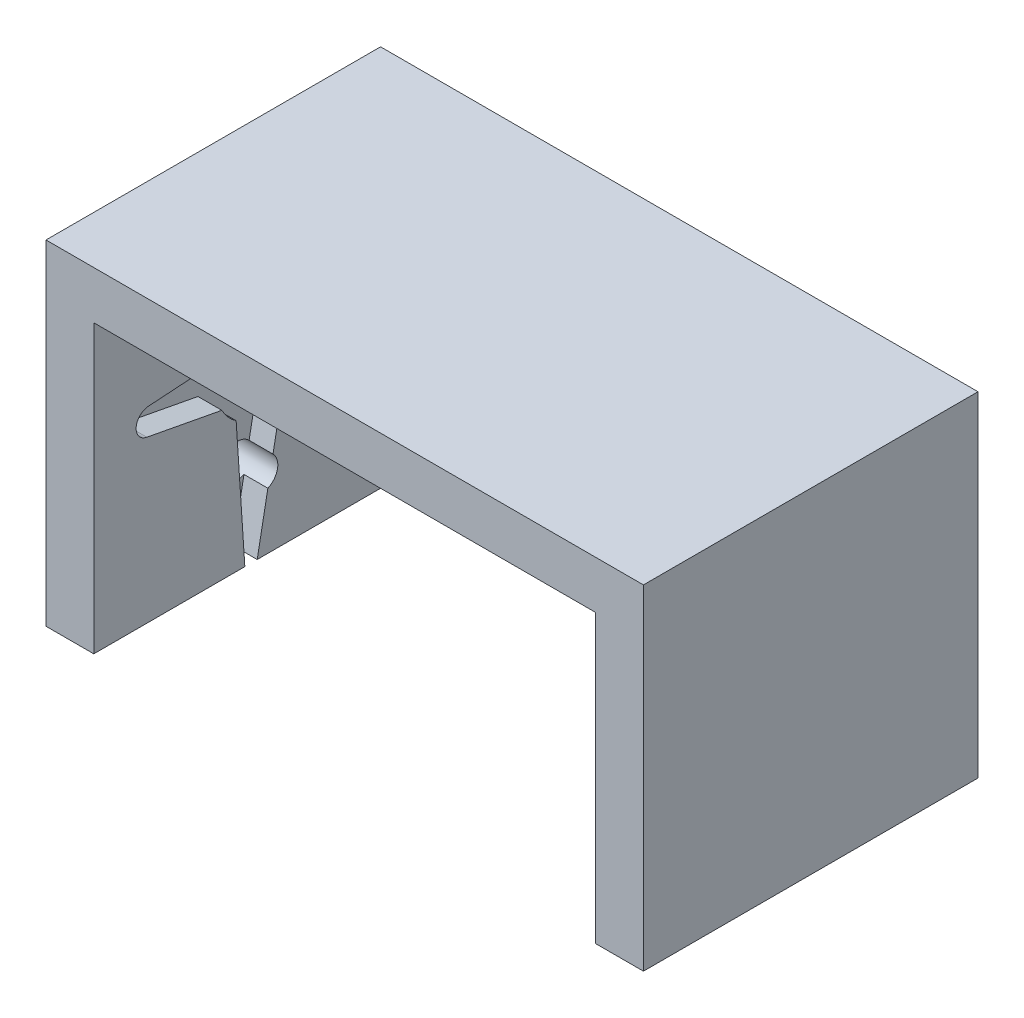
ISO-10303-21;
HEADER;
FILE_DESCRIPTION(('STEP AP214'),'2;1');
FILE_NAME('part.step','',(''),(''),'','','');
FILE_SCHEMA(('AUTOMOTIVE_DESIGN { 1 0 10303 214 1 1 1 1 }'));
ENDSEC;
DATA;
#1=APPLICATION_CONTEXT('core data for automotive mechanical design processes');
#2=APPLICATION_PROTOCOL_DEFINITION('international standard','automotive_design',2000,#1);
#3=PRODUCT_CONTEXT('',#1,'mechanical');
#4=PRODUCT('Part','Part','',(#3));
#5=PRODUCT_RELATED_PRODUCT_CATEGORY('part','',(#4));
#6=PRODUCT_DEFINITION_FORMATION('','',#4);
#7=PRODUCT_DEFINITION_CONTEXT('part definition',#1,'design');
#8=PRODUCT_DEFINITION('design','',#6,#7);
#9=PRODUCT_DEFINITION_SHAPE('','',#8);
#10=(LENGTH_UNIT() NAMED_UNIT(*) SI_UNIT(.MILLI.,.METRE.));
#11=(NAMED_UNIT(*) PLANE_ANGLE_UNIT() SI_UNIT($,.RADIAN.));
#12=(NAMED_UNIT(*) SI_UNIT($,.STERADIAN.) SOLID_ANGLE_UNIT());
#13=UNCERTAINTY_MEASURE_WITH_UNIT(LENGTH_MEASURE(1.E-05),#10,'distance_accuracy_value','');
#14=(GEOMETRIC_REPRESENTATION_CONTEXT(3) GLOBAL_UNCERTAINTY_ASSIGNED_CONTEXT((#13)) GLOBAL_UNIT_ASSIGNED_CONTEXT((#10,
#11,#12)) REPRESENTATION_CONTEXT('',''));
#15=CARTESIAN_POINT('',(0.,0.,0.));
#16=DIRECTION('',(0.,0.,1.));
#17=DIRECTION('',(1.,0.,0.));
#18=AXIS2_PLACEMENT_3D('',#15,#16,#17);
#19=CARTESIAN_POINT('',(-52.5,-60.,35.));
#20=DIRECTION('',(-1.,0.,0.));
#21=DIRECTION('',(0.,0.,1.));
#22=AXIS2_PLACEMENT_3D('',#19,#20,#21);
#23=PLANE('',#22);
#24=DIRECTION('',(0.,0.,1.));
#25=VECTOR('',#24,1.);
#26=CARTESIAN_POINT('',(-52.5,-60.,35.));
#27=LINE('',#26,#25);
#28=CARTESIAN_POINT('',(-52.5,-60.,3.39593215230434));
#29=VERTEX_POINT('',#28);
#30=CARTESIAN_POINT('',(-52.5,-60.,35.));
#31=VERTEX_POINT('',#30);
#32=EDGE_CURVE('E368',#29,#31,#27,.T.);
#33=ORIENTED_EDGE('',*,*,#32,.F.);
#34=DIRECTION('',(0.,-0.997785493856374,-0.0665139703355023));
#35=VECTOR('',#34,1.);
#36=CARTESIAN_POINT('',(-52.5,-0.490823219577113,7.36290866522704));
#37=LINE('',#36,#35);
#38=CARTESIAN_POINT('',(-52.5,-32.6363414986812,5.22003721399762));
#39=VERTEX_POINT('',#38);
#40=EDGE_CURVE('E313',#39,#29,#37,.T.);
#41=ORIENTED_EDGE('',*,*,#40,.F.);
#42=CARTESIAN_POINT('',(-52.5,-25.,0.));
#43=DIRECTION('',(1.,0.,0.));
#44=DIRECTION('',(0.,0.,-1.));
#45=AXIS2_PLACEMENT_3D('',#42,#43,#44);
#46=CIRCLE('',#45,9.25);
#47=CARTESIAN_POINT('',(-52.5,-29.2626707999104,8.20927144462841));
#48=VERTEX_POINT('',#47);
#49=EDGE_CURVE('E310',#48,#39,#46,.T.);
#50=ORIENTED_EDGE('',*,*,#49,.F.);
#51=DIRECTION('',(0.,0.18616079610696,0.982519291410007));
#52=VECTOR('',#51,1.);
#53=CARTESIAN_POINT('',(-52.5,-29.7500780146594,5.6368340610444));
#54=LINE('',#53,#52);
#55=CARTESIAN_POINT('',(-52.5,-26.2884644062094,23.9065354204832));
#56=VERTEX_POINT('',#55);
#57=EDGE_CURVE('E307',#48,#56,#54,.T.);
#58=ORIENTED_EDGE('',*,*,#57,.T.);
#59=CARTESIAN_POINT('',(-52.5,-23.5865363548319,23.3945932311891));
#60=DIRECTION('',(1.,0.,0.));
#61=DIRECTION('',(0.,0.,-1.));
#62=AXIS2_PLACEMENT_3D('',#59,#60,#61);
#63=CIRCLE('',#62,2.75);
#64=CARTESIAN_POINT('',(-52.5,-20.8426262467269,23.5775066496117));
#65=VERTEX_POINT('',#64);
#66=EDGE_CURVE('E304',#65,#56,#63,.T.);
#67=ORIENTED_EDGE('',*,*,#66,.F.);
#68=DIRECTION('',(0.,0.0665139703354918,-0.997785493856375));
#69=VECTOR('',#68,1.);
#70=CARTESIAN_POINT('',(-52.5,-19.1856554970171,-1.27894635515643));
#71=LINE('',#70,#69);
#72=CARTESIAN_POINT('',(-52.5,-19.7799627860023,7.63634149868115));
#73=VERTEX_POINT('',#72);
#74=EDGE_CURVE('E301',#65,#73,#71,.T.);
#75=ORIENTED_EDGE('',*,*,#74,.T.);
#76=CARTESIAN_POINT('',(-52.5,-25.,0.));
#77=DIRECTION('',(1.,0.,0.));
#78=DIRECTION('',(0.,0.,-1.));
#79=AXIS2_PLACEMENT_3D('',#76,#77,#78);
#80=CIRCLE('',#79,9.25);
#81=CARTESIAN_POINT('',(-52.5,-16.7907285553716,4.26267079991049));
#82=VERTEX_POINT('',#81);
#83=EDGE_CURVE('E298',#82,#73,#80,.T.);
#84=ORIENTED_EDGE('',*,*,#83,.F.);
#85=DIRECTION('',(0.,0.982519291410008,-0.186160796106958));
#86=VECTOR('',#85,1.);
#87=CARTESIAN_POINT('',(-52.5,0.197773673881687,1.04380972785561));
#88=LINE('',#87,#86);
#89=CARTESIAN_POINT('',(-52.5,0.,1.08128248274267));
#90=VERTEX_POINT('',#89);
#91=EDGE_CURVE('E295',#82,#90,#88,.T.);
#92=ORIENTED_EDGE('',*,*,#91,.T.);
#93=DIRECTION('',(0.,0.,1.));
#94=VECTOR('',#93,1.);
#95=CARTESIAN_POINT('',(-52.5,0.,35.));
#96=LINE('',#95,#94);
#97=CARTESIAN_POINT('',(-52.5,0.,35.));
#98=VERTEX_POINT('',#97);
#99=EDGE_CURVE('E361',#90,#98,#96,.T.);
#100=ORIENTED_EDGE('',*,*,#99,.T.);
#101=DIRECTION('',(0.,1.,0.));
#102=VECTOR('',#101,1.);
#103=CARTESIAN_POINT('',(-52.5,-60.,35.));
#104=LINE('',#103,#102);
#105=EDGE_CURVE('E375',#31,#98,#104,.T.);
#106=ORIENTED_EDGE('',*,*,#105,.F.);
#107=EDGE_LOOP('',(#33,#41,#50,#58,#67,#75,#84,#92,#100,#106));
#108=FACE_BOUND('',#107,.T.);
#109=ADVANCED_FACE('F33',(#108),#23,.F.);
#110=CARTESIAN_POINT('',(0.,0.,0.));
#111=DIRECTION('',(0.,1.,0.));
#112=DIRECTION('',(0.,0.,1.));
#113=AXIS2_PLACEMENT_3D('',#110,#111,#112);
#114=PLANE('',#113);
#115=DIRECTION('',(0.,0.,-1.));
#116=VECTOR('',#115,1.);
#117=CARTESIAN_POINT('',(52.5,0.,35.));
#118=LINE('',#117,#116);
#119=CARTESIAN_POINT('',(52.5,0.,35.));
#120=VERTEX_POINT('',#119);
#121=CARTESIAN_POINT('',(52.5,0.,-35.));
#122=VERTEX_POINT('',#121);
#123=EDGE_CURVE('E227',#120,#122,#118,.T.);
#124=ORIENTED_EDGE('',*,*,#123,.F.);
#125=DIRECTION('',(1.,0.,0.));
#126=VECTOR('',#125,1.);
#127=CARTESIAN_POINT('',(-62.5,0.,35.));
#128=LINE('',#127,#126);
#129=EDGE_CURVE('E387',#98,#120,#128,.T.);
#130=ORIENTED_EDGE('',*,*,#129,.F.);
#131=ORIENTED_EDGE('',*,*,#99,.F.);
#132=DIRECTION('',(1.,0.,0.));
#133=VECTOR('',#132,1.);
#134=CARTESIAN_POINT('',(-57.5,0.,1.08128248274267));
#135=LINE('',#134,#133);
#136=CARTESIAN_POINT('',(-57.5,0.,1.08128248274267));
#137=VERTEX_POINT('',#136);
#138=EDGE_CURVE('E331',#137,#90,#135,.T.);
#139=ORIENTED_EDGE('',*,*,#138,.F.);
#140=DIRECTION('',(0.,0.,1.));
#141=VECTOR('',#140,1.);
#142=CARTESIAN_POINT('',(-57.5,0.,0.));
#143=LINE('',#142,#141);
#144=CARTESIAN_POINT('',(-57.5,0.,-4.06254808072844));
#145=VERTEX_POINT('',#144);
#146=EDGE_CURVE('E255',#145,#137,#143,.T.);
#147=ORIENTED_EDGE('',*,*,#146,.F.);
#148=DIRECTION('',(1.,0.,0.));
#149=VECTOR('',#148,1.);
#150=CARTESIAN_POINT('',(-57.5,0.,-4.06254808072844));
#151=LINE('',#150,#149);
#152=CARTESIAN_POINT('',(-52.5,0.,-4.06254808072844));
#153=VERTEX_POINT('',#152);
#154=EDGE_CURVE('E333',#145,#153,#151,.T.);
#155=ORIENTED_EDGE('',*,*,#154,.T.);
#156=CARTESIAN_POINT('',(-52.5,0.,-35.));
#157=VERTEX_POINT('',#156);
#158=EDGE_CURVE('E366',#157,#153,#96,.T.);
#159=ORIENTED_EDGE('',*,*,#158,.F.);
#160=DIRECTION('',(-1.,0.,0.));
#161=VECTOR('',#160,1.);
#162=CARTESIAN_POINT('',(-62.5,0.,-35.));
#163=LINE('',#162,#161);
#164=EDGE_CURVE('E56',#122,#157,#163,.T.);
#165=ORIENTED_EDGE('',*,*,#164,.F.);
#166=EDGE_LOOP('',(#124,#130,#131,#139,#147,#155,#159,#165));
#167=FACE_BOUND('',#166,.T.);
#168=ADVANCED_FACE('F435',(#167),#114,.F.);
#169=CARTESIAN_POINT('',(62.5,10.,-35.));
#170=DIRECTION('',(-1.,0.,0.));
#171=DIRECTION('',(0.,0.,1.));
#172=AXIS2_PLACEMENT_3D('',#169,#170,#171);
#173=PLANE('',#172);
#174=DIRECTION('',(0.,-1.,0.));
#175=VECTOR('',#174,1.);
#176=CARTESIAN_POINT('',(62.5,10.,35.));
#177=LINE('',#176,#175);
#178=CARTESIAN_POINT('',(62.5,10.,35.));
#179=VERTEX_POINT('',#178);
#180=CARTESIAN_POINT('',(62.5,-60.,35.));
#181=VERTEX_POINT('',#180);
#182=EDGE_CURVE('E393',#179,#181,#177,.T.);
#183=ORIENTED_EDGE('',*,*,#182,.T.);
#184=DIRECTION('',(0.,0.,1.));
#185=VECTOR('',#184,1.);
#186=CARTESIAN_POINT('',(62.5,-60.,35.));
#187=LINE('',#186,#185);
#188=CARTESIAN_POINT('',(62.5,-60.,-35.));
#189=VERTEX_POINT('',#188);
#190=EDGE_CURVE('E346',#189,#181,#187,.T.);
#191=ORIENTED_EDGE('',*,*,#190,.F.);
#192=DIRECTION('',(0.,-1.,0.));
#193=VECTOR('',#192,1.);
#194=CARTESIAN_POINT('',(62.5,10.,-35.));
#195=LINE('',#194,#193);
#196=CARTESIAN_POINT('',(62.5,10.,-35.));
#197=VERTEX_POINT('',#196);
#198=EDGE_CURVE('E11',#197,#189,#195,.T.);
#199=ORIENTED_EDGE('',*,*,#198,.F.);
#200=DIRECTION('',(0.,0.,-1.));
#201=VECTOR('',#200,1.);
#202=CARTESIAN_POINT('',(62.5,10.,-35.));
#203=LINE('',#202,#201);
#204=EDGE_CURVE('E383',#179,#197,#203,.T.);
#205=ORIENTED_EDGE('',*,*,#204,.F.);
#206=EDGE_LOOP('',(#183,#191,#199,#205));
#207=FACE_BOUND('',#206,.T.);
#208=ADVANCED_FACE('F35',(#207),#173,.F.);
#209=CARTESIAN_POINT('',(-62.5,10.,-35.));
#210=DIRECTION('',(0.,0.,1.));
#211=DIRECTION('',(1.,0.,0.));
#212=AXIS2_PLACEMENT_3D('',#209,#210,#211);
#213=PLANE('',#212);
#214=ORIENTED_EDGE('',*,*,#198,.T.);
#215=DIRECTION('',(1.,0.,0.));
#216=VECTOR('',#215,1.);
#217=CARTESIAN_POINT('',(62.5,-60.,-35.));
#218=LINE('',#217,#216);
#219=CARTESIAN_POINT('',(52.5,-60.,-35.));
#220=VERTEX_POINT('',#219);
#221=EDGE_CURVE('E353',#220,#189,#218,.T.);
#222=ORIENTED_EDGE('',*,*,#221,.F.);
#223=DIRECTION('',(0.,1.,0.));
#224=VECTOR('',#223,1.);
#225=CARTESIAN_POINT('',(52.5,-60.,-35.));
#226=LINE('',#225,#224);
#227=EDGE_CURVE('E356',#220,#122,#226,.T.);
#228=ORIENTED_EDGE('',*,*,#227,.T.);
#229=ORIENTED_EDGE('',*,*,#164,.T.);
#230=DIRECTION('',(0.,1.,0.));
#231=VECTOR('',#230,1.);
#232=CARTESIAN_POINT('',(-52.5,-60.,-35.));
#233=LINE('',#232,#231);
#234=CARTESIAN_POINT('',(-52.5,-60.,-35.));
#235=VERTEX_POINT('',#234);
#236=EDGE_CURVE('E380',#235,#157,#233,.T.);
#237=ORIENTED_EDGE('',*,*,#236,.F.);
#238=DIRECTION('',(1.,0.,0.));
#239=VECTOR('',#238,1.);
#240=CARTESIAN_POINT('',(-62.5,-60.,-35.));
#241=LINE('',#240,#239);
#242=CARTESIAN_POINT('',(-62.5,-60.,-35.));
#243=VERTEX_POINT('',#242);
#244=EDGE_CURVE('E365',#243,#235,#241,.T.);
#245=ORIENTED_EDGE('',*,*,#244,.F.);
#246=DIRECTION('',(0.,-1.,0.));
#247=VECTOR('',#246,1.);
#248=CARTESIAN_POINT('',(-62.5,10.,-35.));
#249=LINE('',#248,#247);
#250=CARTESIAN_POINT('',(-62.5,10.,-35.));
#251=VERTEX_POINT('',#250);
#252=EDGE_CURVE('E41',#251,#243,#249,.T.);
#253=ORIENTED_EDGE('',*,*,#252,.F.);
#254=DIRECTION('',(-1.,0.,0.));
#255=VECTOR('',#254,1.);
#256=CARTESIAN_POINT('',(-62.5,10.,-35.));
#257=LINE('',#256,#255);
#258=EDGE_CURVE('E386',#197,#251,#257,.T.);
#259=ORIENTED_EDGE('',*,*,#258,.F.);
#260=EDGE_LOOP('',(#214,#222,#228,#229,#237,#245,#253,#259));
#261=FACE_BOUND('',#260,.T.);
#262=ADVANCED_FACE('F406',(#261),#213,.F.);
#263=CARTESIAN_POINT('',(-62.5,10.,-35.));
#264=DIRECTION('',(1.,0.,0.));
#265=DIRECTION('',(0.,0.,-1.));
#266=AXIS2_PLACEMENT_3D('',#263,#264,#265);
#267=PLANE('',#266);
#268=CARTESIAN_POINT('',(-62.5,-45.,0.));
#269=DIRECTION('',(-1.,0.,0.));
#270=DIRECTION('',(0.,0.,1.));
#271=AXIS2_PLACEMENT_3D('',#268,#269,#270);
#272=CIRCLE('',#271,3.50000000000001);
#273=CARTESIAN_POINT('',(-62.5,-45.,3.50000000000002));
#274=VERTEX_POINT('',#273);
#275=EDGE_CURVE('E691',#274,#274,#272,.T.);
#276=ORIENTED_EDGE('',*,*,#275,.F.);
#277=EDGE_LOOP('',(#276));
#278=FACE_BOUND('',#277,.T.);
#279=ORIENTED_EDGE('',*,*,#252,.T.);
#280=DIRECTION('',(0.,0.,-1.));
#281=VECTOR('',#280,1.);
#282=CARTESIAN_POINT('',(-62.5,-60.,35.));
#283=LINE('',#282,#281);
#284=CARTESIAN_POINT('',(-62.5,-60.,35.));
#285=VERTEX_POINT('',#284);
#286=EDGE_CURVE('E362',#285,#243,#283,.T.);
#287=ORIENTED_EDGE('',*,*,#286,.F.);
#288=DIRECTION('',(0.,-1.,0.));
#289=VECTOR('',#288,1.);
#290=CARTESIAN_POINT('',(-62.5,10.,35.));
#291=LINE('',#290,#289);
#292=CARTESIAN_POINT('',(-62.5,10.,35.));
#293=VERTEX_POINT('',#292);
#294=EDGE_CURVE('E398',#293,#285,#291,.T.);
#295=ORIENTED_EDGE('',*,*,#294,.F.);
#296=DIRECTION('',(0.,0.,1.));
#297=VECTOR('',#296,1.);
#298=CARTESIAN_POINT('',(-62.5,10.,-35.));
#299=LINE('',#298,#297);
#300=EDGE_CURVE('E389',#251,#293,#299,.T.);
#301=ORIENTED_EDGE('',*,*,#300,.F.);
#302=EDGE_LOOP('',(#279,#287,#295,#301));
#303=FACE_BOUND('',#302,.T.);
#304=ADVANCED_FACE('F404',(#278,#303),#267,.F.);
#305=CARTESIAN_POINT('',(-62.5,10.,35.));
#306=DIRECTION('',(0.,0.,-1.));
#307=DIRECTION('',(-1.,0.,0.));
#308=AXIS2_PLACEMENT_3D('',#305,#306,#307);
#309=PLANE('',#308);
#310=ORIENTED_EDGE('',*,*,#294,.T.);
#311=DIRECTION('',(-1.,0.,0.));
#312=VECTOR('',#311,1.);
#313=CARTESIAN_POINT('',(-62.5,-60.,35.));
#314=LINE('',#313,#312);
#315=EDGE_CURVE('E372',#31,#285,#314,.T.);
#316=ORIENTED_EDGE('',*,*,#315,.F.);
#317=ORIENTED_EDGE('',*,*,#105,.T.);
#318=ORIENTED_EDGE('',*,*,#129,.T.);
#319=DIRECTION('',(0.,1.,0.));
#320=VECTOR('',#319,1.);
#321=CARTESIAN_POINT('',(52.5,-60.,35.));
#322=LINE('',#321,#320);
#323=CARTESIAN_POINT('',(52.5,-60.,35.));
#324=VERTEX_POINT('',#323);
#325=EDGE_CURVE('E359',#324,#120,#322,.T.);
#326=ORIENTED_EDGE('',*,*,#325,.F.);
#327=DIRECTION('',(-1.,0.,0.));
#328=VECTOR('',#327,1.);
#329=CARTESIAN_POINT('',(62.5,-60.,35.));
#330=LINE('',#329,#328);
#331=EDGE_CURVE('E349',#181,#324,#330,.T.);
#332=ORIENTED_EDGE('',*,*,#331,.F.);
#333=ORIENTED_EDGE('',*,*,#182,.F.);
#334=DIRECTION('',(1.,0.,0.));
#335=VECTOR('',#334,1.);
#336=CARTESIAN_POINT('',(-62.5,10.,35.));
#337=LINE('',#336,#335);
#338=EDGE_CURVE('E391',#293,#179,#337,.T.);
#339=ORIENTED_EDGE('',*,*,#338,.F.);
#340=EDGE_LOOP('',(#310,#316,#317,#318,#326,#332,#333,#339));
#341=FACE_BOUND('',#340,.T.);
#342=ADVANCED_FACE('F414',(#341),#309,.F.);
#343=CARTESIAN_POINT('',(0.,10.,0.));
#344=DIRECTION('',(0.,1.,0.));
#345=DIRECTION('',(0.,0.,1.));
#346=AXIS2_PLACEMENT_3D('',#343,#344,#345);
#347=PLANE('',#346);
#348=ORIENTED_EDGE('',*,*,#204,.T.);
#349=ORIENTED_EDGE('',*,*,#258,.T.);
#350=ORIENTED_EDGE('',*,*,#300,.T.);
#351=ORIENTED_EDGE('',*,*,#338,.T.);
#352=EDGE_LOOP('',(#348,#349,#350,#351));
#353=FACE_BOUND('',#352,.T.);
#354=ADVANCED_FACE('F420',(#353),#347,.T.);
#355=DIRECTION('',(0.,0.982519291410009,-0.186160796106949));
#356=VECTOR('',#355,1.);
#357=CARTESIAN_POINT('',(-52.5,-1.93056577424036,-10.1891384018219));
#358=LINE('',#357,#356);
#359=CARTESIAN_POINT('',(-52.5,-42.5443303621563,-2.49392995686979));
#360=VERTEX_POINT('',#359);
#361=CARTESIAN_POINT('',(-52.5,-33.2092714446283,-4.26267079991049));
#362=VERTEX_POINT('',#361);
#363=EDGE_CURVE('E273',#360,#362,#358,.T.);
#364=ORIENTED_EDGE('',*,*,#363,.F.);
#365=CARTESIAN_POINT('',(-52.5,-45.,0.));
#366=DIRECTION('',(-1.,0.,0.));
#367=DIRECTION('',(0.,0.,1.));
#368=AXIS2_PLACEMENT_3D('',#365,#366,#367);
#369=CIRCLE('',#368,3.50000000000001);
#370=CARTESIAN_POINT('',(-52.5,-48.1977754056788,-1.42275523363492));
#371=VERTEX_POINT('',#370);
#372=EDGE_CURVE('E277',#360,#371,#369,.T.);
#373=ORIENTED_EDGE('',*,*,#372,.T.);
#374=CARTESIAN_POINT('',(-52.5,-60.,0.813446686796371));
#375=VERTEX_POINT('',#374);
#376=EDGE_CURVE('E218',#375,#371,#358,.T.);
#377=ORIENTED_EDGE('',*,*,#376,.F.);
#378=EDGE_CURVE('E369',#235,#375,#27,.T.);
#379=ORIENTED_EDGE('',*,*,#378,.F.);
#380=ORIENTED_EDGE('',*,*,#236,.T.);
#381=ORIENTED_EDGE('',*,*,#158,.T.);
#382=DIRECTION('',(0.,-0.997785493856374,-0.0665139703354938));
#383=VECTOR('',#382,1.);
#384=CARTESIAN_POINT('',(-52.5,0.269617807087483,-4.04457492824932));
#385=LINE('',#384,#383);
#386=CARTESIAN_POINT('',(-52.5,-17.3636585013188,-5.22003721399761));
#387=VERTEX_POINT('',#386);
#388=EDGE_CURVE('E292',#153,#387,#385,.T.);
#389=ORIENTED_EDGE('',*,*,#388,.T.);
#390=CARTESIAN_POINT('',(-52.5,-25.,0.));
#391=DIRECTION('',(1.,0.,0.));
#392=DIRECTION('',(0.,0.,-1.));
#393=AXIS2_PLACEMENT_3D('',#390,#391,#392);
#394=CIRCLE('',#393,9.25);
#395=CARTESIAN_POINT('',(-52.5,-20.7373292000895,-8.20927144462836));
#396=VERTEX_POINT('',#395);
#397=EDGE_CURVE('E289',#396,#387,#394,.T.);
#398=ORIENTED_EDGE('',*,*,#397,.F.);
#399=DIRECTION('',(0.,-0.18616079610696,-0.982519291410007));
#400=VECTOR('',#399,1.);
#401=CARTESIAN_POINT('',(-52.5,-18.5171298849817,3.50849461292222));
#402=LINE('',#401,#400);
#403=CARTESIAN_POINT('',(-52.5,-23.7115355937906,-23.9065354204831));
#404=VERTEX_POINT('',#403);
#405=EDGE_CURVE('E286',#396,#404,#402,.T.);
#406=ORIENTED_EDGE('',*,*,#405,.T.);
#407=CARTESIAN_POINT('',(-52.5,-26.4134636451681,-23.394593231189));
#408=DIRECTION('',(1.,0.,0.));
#409=DIRECTION('',(0.,0.,-1.));
#410=AXIS2_PLACEMENT_3D('',#407,#408,#409);
#411=CIRCLE('',#410,2.75);
#412=CARTESIAN_POINT('',(-52.5,-29.1573737532731,-23.5775066496116));
#413=VERTEX_POINT('',#412);
#414=EDGE_CURVE('E283',#413,#404,#411,.T.);
#415=ORIENTED_EDGE('',*,*,#414,.F.);
#416=DIRECTION('',(0.,-0.0665139703354918,0.997785493856375));
#417=VECTOR('',#416,1.);
#418=CARTESIAN_POINT('',(-52.5,-30.5931390904933,-2.03938738182093));
#419=LINE('',#418,#417);
#420=CARTESIAN_POINT('',(-52.5,-30.2200372139976,-7.6363414986811));
#421=VERTEX_POINT('',#420);
#422=EDGE_CURVE('E280',#413,#421,#419,.T.);
#423=ORIENTED_EDGE('',*,*,#422,.T.);
#424=CARTESIAN_POINT('',(-52.5,-25.,0.));
#425=DIRECTION('',(1.,0.,0.));
#426=DIRECTION('',(0.,0.,-1.));
#427=AXIS2_PLACEMENT_3D('',#424,#425,#426);
#428=CIRCLE('',#427,9.25);
#429=EDGE_CURVE('E276',#362,#421,#428,.T.);
#430=ORIENTED_EDGE('',*,*,#429,.F.);
#431=EDGE_LOOP('',(#364,#373,#377,#379,#380,#381,#389,#398,#406,#415,#423,#430));
#432=FACE_BOUND('',#431,.T.);
#433=ADVANCED_FACE('F440',(#432),#23,.F.);
#434=CARTESIAN_POINT('',(0.,-60.,0.));
#435=DIRECTION('',(0.,-1.,0.));
#436=DIRECTION('',(0.,0.,-1.));
#437=AXIS2_PLACEMENT_3D('',#434,#435,#436);
#438=PLANE('',#437);
#439=DIRECTION('',(1.,0.,0.));
#440=VECTOR('',#439,1.);
#441=CARTESIAN_POINT('',(-57.5,-60.,0.81344668679637));
#442=LINE('',#441,#440);
#443=CARTESIAN_POINT('',(-57.5,-60.,0.81344668679637));
#444=VERTEX_POINT('',#443);
#445=EDGE_CURVE('E228',#444,#375,#442,.T.);
#446=ORIENTED_EDGE('',*,*,#445,.F.);
#447=DIRECTION('',(0.,0.,-1.));
#448=VECTOR('',#447,1.);
#449=CARTESIAN_POINT('',(-57.5,-60.,0.));
#450=LINE('',#449,#448);
#451=CARTESIAN_POINT('',(-57.5,-60.,3.39593215230434));
#452=VERTEX_POINT('',#451);
#453=EDGE_CURVE('E232',#452,#444,#450,.T.);
#454=ORIENTED_EDGE('',*,*,#453,.F.);
#455=DIRECTION('',(1.,0.,0.));
#456=VECTOR('',#455,1.);
#457=CARTESIAN_POINT('',(-57.5,-60.,3.39593215230434));
#458=LINE('',#457,#456);
#459=EDGE_CURVE('E316',#452,#29,#458,.T.);
#460=ORIENTED_EDGE('',*,*,#459,.T.);
#461=ORIENTED_EDGE('',*,*,#32,.T.);
#462=ORIENTED_EDGE('',*,*,#315,.T.);
#463=ORIENTED_EDGE('',*,*,#286,.T.);
#464=ORIENTED_EDGE('',*,*,#244,.T.);
#465=ORIENTED_EDGE('',*,*,#378,.T.);
#466=EDGE_LOOP('',(#446,#454,#460,#461,#462,#463,#464,#465));
#467=FACE_BOUND('',#466,.T.);
#468=ADVANCED_FACE('F409',(#467),#438,.T.);
#469=CARTESIAN_POINT('',(52.5,-60.,35.));
#470=DIRECTION('',(1.,0.,0.));
#471=DIRECTION('',(0.,0.,-1.));
#472=AXIS2_PLACEMENT_3D('',#469,#470,#471);
#473=PLANE('',#472);
#474=ORIENTED_EDGE('',*,*,#123,.T.);
#475=ORIENTED_EDGE('',*,*,#227,.F.);
#476=DIRECTION('',(0.,0.,-1.));
#477=VECTOR('',#476,1.);
#478=CARTESIAN_POINT('',(52.5,-60.,35.));
#479=LINE('',#478,#477);
#480=EDGE_CURVE('E351',#324,#220,#479,.T.);
#481=ORIENTED_EDGE('',*,*,#480,.F.);
#482=ORIENTED_EDGE('',*,*,#325,.T.);
#483=EDGE_LOOP('',(#474,#475,#481,#482));
#484=FACE_BOUND('',#483,.T.);
#485=ADVANCED_FACE('F433',(#484),#473,.F.);
#486=CARTESIAN_POINT('',(0.,-60.,0.));
#487=DIRECTION('',(0.,1.,0.));
#488=DIRECTION('',(0.,0.,1.));
#489=AXIS2_PLACEMENT_3D('',#486,#487,#488);
#490=PLANE('',#489);
#491=ORIENTED_EDGE('',*,*,#190,.T.);
#492=ORIENTED_EDGE('',*,*,#331,.T.);
#493=ORIENTED_EDGE('',*,*,#480,.T.);
#494=ORIENTED_EDGE('',*,*,#221,.T.);
#495=EDGE_LOOP('',(#491,#492,#493,#494));
#496=FACE_BOUND('',#495,.T.);
#497=ADVANCED_FACE('F426',(#496),#490,.F.);
#498=CARTESIAN_POINT('',(-57.5,-1.93056577424036,-10.1891384018219));
#499=DIRECTION('',(0.,-0.186160796106949,-0.982519291410009));
#500=DIRECTION('',(0.,0.982519291410009,-0.186160796106949));
#501=AXIS2_PLACEMENT_3D('',#498,#499,#500);
#502=PLANE('',#501);
#503=ORIENTED_EDGE('',*,*,#376,.T.);
#504=DIRECTION('',(1.,0.,0.));
#505=VECTOR('',#504,1.);
#506=CARTESIAN_POINT('',(-57.5,-48.1977754056788,-1.42275523363492));
#507=LINE('',#506,#505);
#508=CARTESIAN_POINT('',(-57.5,-48.1977754056788,-1.42275523363492));
#509=VERTEX_POINT('',#508);
#510=EDGE_CURVE('E210',#509,#371,#507,.T.);
#511=ORIENTED_EDGE('',*,*,#510,.F.);
#512=DIRECTION('',(0.,0.982519291410009,-0.186160796106949));
#513=VECTOR('',#512,1.);
#514=CARTESIAN_POINT('',(-57.5,-1.93056577424036,-10.1891384018219));
#515=LINE('',#514,#513);
#516=EDGE_CURVE('E224',#444,#509,#515,.T.);
#517=ORIENTED_EDGE('',*,*,#516,.F.);
#518=ORIENTED_EDGE('',*,*,#445,.T.);
#519=EDGE_LOOP('',(#503,#511,#517,#518));
#520=FACE_BOUND('',#519,.T.);
#521=ADVANCED_FACE('F223',(#520),#502,.F.);
#522=CARTESIAN_POINT('',(-57.5,-0.490823219577113,7.36290866522704));
#523=DIRECTION('',(0.,-0.0665139703355023,0.997785493856374));
#524=DIRECTION('',(0.,-0.997785493856374,-0.0665139703355023));
#525=AXIS2_PLACEMENT_3D('',#522,#523,#524);
#526=PLANE('',#525);
#527=ORIENTED_EDGE('',*,*,#40,.T.);
#528=ORIENTED_EDGE('',*,*,#459,.F.);
#529=DIRECTION('',(0.,-0.997785493856374,-0.0665139703355023));
#530=VECTOR('',#529,1.);
#531=CARTESIAN_POINT('',(-57.5,-0.490823219577113,7.36290866522704));
#532=LINE('',#531,#530);
#533=CARTESIAN_POINT('',(-57.5,-32.6363414986812,5.22003721399762));
#534=VERTEX_POINT('',#533);
#535=EDGE_CURVE('E48',#534,#452,#532,.T.);
#536=ORIENTED_EDGE('',*,*,#535,.F.);
#537=DIRECTION('',(1.,0.,0.));
#538=VECTOR('',#537,1.);
#539=CARTESIAN_POINT('',(-57.5,-32.6363414986812,5.22003721399762));
#540=LINE('',#539,#538);
#541=EDGE_CURVE('E319',#534,#39,#540,.T.);
#542=ORIENTED_EDGE('',*,*,#541,.T.);
#543=EDGE_LOOP('',(#527,#528,#536,#542));
#544=FACE_BOUND('',#543,.T.);
#545=ADVANCED_FACE('F488',(#544),#526,.F.);
#546=CARTESIAN_POINT('',(-57.5,-25.,0.));
#547=DIRECTION('',(1.,0.,0.));
#548=DIRECTION('',(0.,0.,-1.));
#549=AXIS2_PLACEMENT_3D('',#546,#547,#548);
#550=CYLINDRICAL_SURFACE('',#549,9.25);
#551=ORIENTED_EDGE('',*,*,#49,.T.);
#552=ORIENTED_EDGE('',*,*,#541,.F.);
#553=CARTESIAN_POINT('',(-57.5,-25.,0.));
#554=DIRECTION('',(1.,0.,0.));
#555=DIRECTION('',(0.,0.,-1.));
#556=AXIS2_PLACEMENT_3D('',#553,#554,#555);
#557=CIRCLE('',#556,9.25);
#558=CARTESIAN_POINT('',(-57.5,-29.2626707999104,8.20927144462841));
#559=VERTEX_POINT('',#558);
#560=EDGE_CURVE('E270',#559,#534,#557,.T.);
#561=ORIENTED_EDGE('',*,*,#560,.F.);
#562=DIRECTION('',(1.,0.,0.));
#563=VECTOR('',#562,1.);
#564=CARTESIAN_POINT('',(-57.5,-29.2626707999104,8.20927144462841));
#565=LINE('',#564,#563);
#566=EDGE_CURVE('E321',#559,#48,#565,.T.);
#567=ORIENTED_EDGE('',*,*,#566,.T.);
#568=EDGE_LOOP('',(#551,#552,#561,#567));
#569=FACE_BOUND('',#568,.T.);
#570=ADVANCED_FACE('F542',(#569),#550,.F.);
#571=CARTESIAN_POINT('',(-57.5,-29.7500780146594,5.6368340610444));
#572=DIRECTION('',(0.,0.982519291410007,-0.18616079610696));
#573=DIRECTION('',(0.,0.18616079610696,0.982519291410007));
#574=AXIS2_PLACEMENT_3D('',#571,#572,#573);
#575=PLANE('',#574);
#576=ORIENTED_EDGE('',*,*,#57,.F.);
#577=ORIENTED_EDGE('',*,*,#566,.F.);
#578=DIRECTION('',(0.,0.18616079610696,0.982519291410007));
#579=VECTOR('',#578,1.);
#580=CARTESIAN_POINT('',(-57.5,-29.7500780146594,5.6368340610444));
#581=LINE('',#580,#579);
#582=CARTESIAN_POINT('',(-57.5,-26.2884644062094,23.9065354204832));
#583=VERTEX_POINT('',#582);
#584=EDGE_CURVE('E268',#559,#583,#581,.T.);
#585=ORIENTED_EDGE('',*,*,#584,.T.);
#586=DIRECTION('',(1.,0.,0.));
#587=VECTOR('',#586,1.);
#588=CARTESIAN_POINT('',(-57.5,-26.2884644062094,23.9065354204832));
#589=LINE('',#588,#587);
#590=EDGE_CURVE('E323',#583,#56,#589,.T.);
#591=ORIENTED_EDGE('',*,*,#590,.T.);
#592=EDGE_LOOP('',(#576,#577,#585,#591));
#593=FACE_BOUND('',#592,.T.);
#594=ADVANCED_FACE('F551',(#593),#575,.T.);
#595=CARTESIAN_POINT('',(-57.5,-23.5865363548319,23.3945932311891));
#596=DIRECTION('',(1.,0.,0.));
#597=DIRECTION('',(0.,0.,-1.));
#598=AXIS2_PLACEMENT_3D('',#595,#596,#597);
#599=CYLINDRICAL_SURFACE('',#598,2.75);
#600=ORIENTED_EDGE('',*,*,#66,.T.);
#601=ORIENTED_EDGE('',*,*,#590,.F.);
#602=CARTESIAN_POINT('',(-57.5,-23.5865363548319,23.3945932311891));
#603=DIRECTION('',(1.,0.,0.));
#604=DIRECTION('',(0.,0.,-1.));
#605=AXIS2_PLACEMENT_3D('',#602,#603,#604);
#606=CIRCLE('',#605,2.75);
#607=CARTESIAN_POINT('',(-57.5,-20.8426262467269,23.5775066496117));
#608=VERTEX_POINT('',#607);
#609=EDGE_CURVE('E265',#608,#583,#606,.T.);
#610=ORIENTED_EDGE('',*,*,#609,.F.);
#611=DIRECTION('',(1.,0.,0.));
#612=VECTOR('',#611,1.);
#613=CARTESIAN_POINT('',(-57.5,-20.8426262467269,23.5775066496117));
#614=LINE('',#613,#612);
#615=EDGE_CURVE('E325',#608,#65,#614,.T.);
#616=ORIENTED_EDGE('',*,*,#615,.T.);
#617=EDGE_LOOP('',(#600,#601,#610,#616));
#618=FACE_BOUND('',#617,.T.);
#619=ADVANCED_FACE('F561',(#618),#599,.F.);
#620=CARTESIAN_POINT('',(-57.5,-19.1856554970171,-1.27894635515643));
#621=DIRECTION('',(0.,-0.997785493856375,-0.0665139703354918));
#622=DIRECTION('',(0.,0.0665139703354918,-0.997785493856375));
#623=AXIS2_PLACEMENT_3D('',#620,#621,#622);
#624=PLANE('',#623);
#625=ORIENTED_EDGE('',*,*,#74,.F.);
#626=ORIENTED_EDGE('',*,*,#615,.F.);
#627=DIRECTION('',(0.,0.0665139703354918,-0.997785493856375));
#628=VECTOR('',#627,1.);
#629=CARTESIAN_POINT('',(-57.5,-19.1856554970171,-1.27894635515643));
#630=LINE('',#629,#628);
#631=CARTESIAN_POINT('',(-57.5,-19.7799627860023,7.63634149868115));
#632=VERTEX_POINT('',#631);
#633=EDGE_CURVE('E263',#608,#632,#630,.T.);
#634=ORIENTED_EDGE('',*,*,#633,.T.);
#635=DIRECTION('',(1.,0.,0.));
#636=VECTOR('',#635,1.);
#637=CARTESIAN_POINT('',(-57.5,-19.7799627860023,7.63634149868115));
#638=LINE('',#637,#636);
#639=EDGE_CURVE('E327',#632,#73,#638,.T.);
#640=ORIENTED_EDGE('',*,*,#639,.T.);
#641=EDGE_LOOP('',(#625,#626,#634,#640));
#642=FACE_BOUND('',#641,.T.);
#643=ADVANCED_FACE('F571',(#642),#624,.T.);
#644=CARTESIAN_POINT('',(-57.5,-25.,0.));
#645=DIRECTION('',(1.,0.,0.));
#646=DIRECTION('',(0.,0.,-1.));
#647=AXIS2_PLACEMENT_3D('',#644,#645,#646);
#648=CYLINDRICAL_SURFACE('',#647,9.25);
#649=ORIENTED_EDGE('',*,*,#83,.T.);
#650=ORIENTED_EDGE('',*,*,#639,.F.);
#651=CARTESIAN_POINT('',(-57.5,-25.,0.));
#652=DIRECTION('',(1.,0.,0.));
#653=DIRECTION('',(0.,0.,-1.));
#654=AXIS2_PLACEMENT_3D('',#651,#652,#653);
#655=CIRCLE('',#654,9.25);
#656=CARTESIAN_POINT('',(-57.5,-16.7907285553716,4.26267079991049));
#657=VERTEX_POINT('',#656);
#658=EDGE_CURVE('E260',#657,#632,#655,.T.);
#659=ORIENTED_EDGE('',*,*,#658,.F.);
#660=DIRECTION('',(1.,0.,0.));
#661=VECTOR('',#660,1.);
#662=CARTESIAN_POINT('',(-57.5,-16.7907285553716,4.26267079991049));
#663=LINE('',#662,#661);
#664=EDGE_CURVE('E329',#657,#82,#663,.T.);
#665=ORIENTED_EDGE('',*,*,#664,.T.);
#666=EDGE_LOOP('',(#649,#650,#659,#665));
#667=FACE_BOUND('',#666,.T.);
#668=ADVANCED_FACE('F581',(#667),#648,.F.);
#669=CARTESIAN_POINT('',(-57.5,0.197773673881687,1.04380972785561));
#670=DIRECTION('',(0.,-0.186160796106958,-0.982519291410008));
#671=DIRECTION('',(0.,0.982519291410008,-0.186160796106957));
#672=AXIS2_PLACEMENT_3D('',#669,#670,#671);
#673=PLANE('',#672);
#674=ORIENTED_EDGE('',*,*,#91,.F.);
#675=ORIENTED_EDGE('',*,*,#664,.F.);
#676=DIRECTION('',(0.,0.982519291410008,-0.186160796106958));
#677=VECTOR('',#676,1.);
#678=CARTESIAN_POINT('',(-57.5,0.197773673881687,1.04380972785561));
#679=LINE('',#678,#677);
#680=EDGE_CURVE('E258',#657,#137,#679,.T.);
#681=ORIENTED_EDGE('',*,*,#680,.T.);
#682=ORIENTED_EDGE('',*,*,#138,.T.);
#683=EDGE_LOOP('',(#674,#675,#681,#682));
#684=FACE_BOUND('',#683,.T.);
#685=ADVANCED_FACE('F591',(#684),#673,.T.);
#686=CARTESIAN_POINT('',(-57.5,0.269617807087483,-4.04457492824932));
#687=DIRECTION('',(0.,-0.0665139703354938,0.997785493856374));
#688=DIRECTION('',(0.,-0.997785493856374,-0.0665139703354938));
#689=AXIS2_PLACEMENT_3D('',#686,#687,#688);
#690=PLANE('',#689);
#691=ORIENTED_EDGE('',*,*,#388,.F.);
#692=ORIENTED_EDGE('',*,*,#154,.F.);
#693=DIRECTION('',(0.,-0.997785493856374,-0.0665139703354938));
#694=VECTOR('',#693,1.);
#695=CARTESIAN_POINT('',(-57.5,0.269617807087483,-4.04457492824932));
#696=LINE('',#695,#694);
#697=CARTESIAN_POINT('',(-57.5,-17.3636585013188,-5.22003721399761));
#698=VERTEX_POINT('',#697);
#699=EDGE_CURVE('E253',#145,#698,#696,.T.);
#700=ORIENTED_EDGE('',*,*,#699,.T.);
#701=DIRECTION('',(1.,0.,0.));
#702=VECTOR('',#701,1.);
#703=CARTESIAN_POINT('',(-57.5,-17.3636585013188,-5.22003721399761));
#704=LINE('',#703,#702);
#705=EDGE_CURVE('E335',#698,#387,#704,.T.);
#706=ORIENTED_EDGE('',*,*,#705,.T.);
#707=EDGE_LOOP('',(#691,#692,#700,#706));
#708=FACE_BOUND('',#707,.T.);
#709=ADVANCED_FACE('F457',(#708),#690,.T.);
#710=CARTESIAN_POINT('',(-57.5,-25.,0.));
#711=DIRECTION('',(1.,0.,0.));
#712=DIRECTION('',(0.,0.,-1.));
#713=AXIS2_PLACEMENT_3D('',#710,#711,#712);
#714=CYLINDRICAL_SURFACE('',#713,9.25);
#715=ORIENTED_EDGE('',*,*,#397,.T.);
#716=ORIENTED_EDGE('',*,*,#705,.F.);
#717=CARTESIAN_POINT('',(-57.5,-25.,0.));
#718=DIRECTION('',(1.,0.,0.));
#719=DIRECTION('',(0.,0.,-1.));
#720=AXIS2_PLACEMENT_3D('',#717,#718,#719);
#721=CIRCLE('',#720,9.25);
#722=CARTESIAN_POINT('',(-57.5,-20.7373292000895,-8.20927144462836));
#723=VERTEX_POINT('',#722);
#724=EDGE_CURVE('E250',#723,#698,#721,.T.);
#725=ORIENTED_EDGE('',*,*,#724,.F.);
#726=DIRECTION('',(1.,0.,0.));
#727=VECTOR('',#726,1.);
#728=CARTESIAN_POINT('',(-57.5,-20.7373292000895,-8.20927144462836));
#729=LINE('',#728,#727);
#730=EDGE_CURVE('E337',#723,#396,#729,.T.);
#731=ORIENTED_EDGE('',*,*,#730,.T.);
#732=EDGE_LOOP('',(#715,#716,#725,#731));
#733=FACE_BOUND('',#732,.T.);
#734=ADVANCED_FACE('F459',(#733),#714,.F.);
#735=CARTESIAN_POINT('',(-57.5,-18.5171298849817,3.50849461292221));
#736=DIRECTION('',(0.,-0.982519291410007,0.18616079610696));
#737=DIRECTION('',(0.,-0.18616079610696,-0.982519291410007));
#738=AXIS2_PLACEMENT_3D('',#735,#736,#737);
#739=PLANE('',#738);
#740=ORIENTED_EDGE('',*,*,#405,.F.);
#741=ORIENTED_EDGE('',*,*,#730,.F.);
#742=DIRECTION('',(0.,-0.18616079610696,-0.982519291410007));
#743=VECTOR('',#742,1.);
#744=CARTESIAN_POINT('',(-57.5,-18.5171298849817,3.50849461292221));
#745=LINE('',#744,#743);
#746=CARTESIAN_POINT('',(-57.5,-23.7115355937906,-23.9065354204831));
#747=VERTEX_POINT('',#746);
#748=EDGE_CURVE('E248',#723,#747,#745,.T.);
#749=ORIENTED_EDGE('',*,*,#748,.T.);
#750=DIRECTION('',(1.,0.,0.));
#751=VECTOR('',#750,1.);
#752=CARTESIAN_POINT('',(-57.5,-23.7115355937906,-23.9065354204831));
#753=LINE('',#752,#751);
#754=EDGE_CURVE('E339',#747,#404,#753,.T.);
#755=ORIENTED_EDGE('',*,*,#754,.T.);
#756=EDGE_LOOP('',(#740,#741,#749,#755));
#757=FACE_BOUND('',#756,.T.);
#758=ADVANCED_FACE('F464',(#757),#739,.T.);
#759=CARTESIAN_POINT('',(-57.5,-26.4134636451681,-23.394593231189));
#760=DIRECTION('',(1.,0.,0.));
#761=DIRECTION('',(0.,0.,-1.));
#762=AXIS2_PLACEMENT_3D('',#759,#760,#761);
#763=CYLINDRICAL_SURFACE('',#762,2.75);
#764=ORIENTED_EDGE('',*,*,#414,.T.);
#765=ORIENTED_EDGE('',*,*,#754,.F.);
#766=CARTESIAN_POINT('',(-57.5,-26.4134636451681,-23.394593231189));
#767=DIRECTION('',(1.,0.,0.));
#768=DIRECTION('',(0.,0.,-1.));
#769=AXIS2_PLACEMENT_3D('',#766,#767,#768);
#770=CIRCLE('',#769,2.75);
#771=CARTESIAN_POINT('',(-57.5,-29.1573737532731,-23.5775066496116));
#772=VERTEX_POINT('',#771);
#773=EDGE_CURVE('E243',#772,#747,#770,.T.);
#774=ORIENTED_EDGE('',*,*,#773,.F.);
#775=DIRECTION('',(1.,0.,0.));
#776=VECTOR('',#775,1.);
#777=CARTESIAN_POINT('',(-57.5,-29.1573737532731,-23.5775066496116));
#778=LINE('',#777,#776);
#779=EDGE_CURVE('E341',#772,#413,#778,.T.);
#780=ORIENTED_EDGE('',*,*,#779,.T.);
#781=EDGE_LOOP('',(#764,#765,#774,#780));
#782=FACE_BOUND('',#781,.T.);
#783=ADVANCED_FACE('F468',(#782),#763,.F.);
#784=CARTESIAN_POINT('',(-57.5,-30.5931390904933,-2.03938738182093));
#785=DIRECTION('',(0.,0.997785493856375,0.0665139703354918));
#786=DIRECTION('',(0.,-0.0665139703354918,0.997785493856375));
#787=AXIS2_PLACEMENT_3D('',#784,#785,#786);
#788=PLANE('',#787);
#789=ORIENTED_EDGE('',*,*,#422,.F.);
#790=ORIENTED_EDGE('',*,*,#779,.F.);
#791=DIRECTION('',(0.,-0.0665139703354918,0.997785493856375));
#792=VECTOR('',#791,1.);
#793=CARTESIAN_POINT('',(-57.5,-30.5931390904933,-2.03938738182093));
#794=LINE('',#793,#792);
#795=CARTESIAN_POINT('',(-57.5,-30.2200372139976,-7.6363414986811));
#796=VERTEX_POINT('',#795);
#797=EDGE_CURVE('E240',#772,#796,#794,.T.);
#798=ORIENTED_EDGE('',*,*,#797,.T.);
#799=DIRECTION('',(1.,0.,0.));
#800=VECTOR('',#799,1.);
#801=CARTESIAN_POINT('',(-57.5,-30.2200372139976,-7.6363414986811));
#802=LINE('',#801,#800);
#803=EDGE_CURVE('E343',#796,#421,#802,.T.);
#804=ORIENTED_EDGE('',*,*,#803,.T.);
#805=EDGE_LOOP('',(#789,#790,#798,#804));
#806=FACE_BOUND('',#805,.T.);
#807=ADVANCED_FACE('F471',(#806),#788,.T.);
#808=CARTESIAN_POINT('',(-57.5,-25.,0.));
#809=DIRECTION('',(1.,0.,0.));
#810=DIRECTION('',(0.,0.,-1.));
#811=AXIS2_PLACEMENT_3D('',#808,#809,#810);
#812=CYLINDRICAL_SURFACE('',#811,9.25);
#813=ORIENTED_EDGE('',*,*,#429,.T.);
#814=ORIENTED_EDGE('',*,*,#803,.F.);
#815=CARTESIAN_POINT('',(-57.5,-25.,0.));
#816=DIRECTION('',(1.,0.,0.));
#817=DIRECTION('',(0.,0.,-1.));
#818=AXIS2_PLACEMENT_3D('',#815,#816,#817);
#819=CIRCLE('',#818,9.25);
#820=CARTESIAN_POINT('',(-57.5,-33.2092714446283,-4.26267079991049));
#821=VERTEX_POINT('',#820);
#822=EDGE_CURVE('E238',#821,#796,#819,.T.);
#823=ORIENTED_EDGE('',*,*,#822,.F.);
#824=DIRECTION('',(1.,0.,0.));
#825=VECTOR('',#824,1.);
#826=CARTESIAN_POINT('',(-57.5,-33.2092714446283,-4.26267079991049));
#827=LINE('',#826,#825);
#828=EDGE_CURVE('E234',#821,#362,#827,.T.);
#829=ORIENTED_EDGE('',*,*,#828,.T.);
#830=EDGE_LOOP('',(#813,#814,#823,#829));
#831=FACE_BOUND('',#830,.T.);
#832=ADVANCED_FACE('F475',(#831),#812,.F.);
#833=ORIENTED_EDGE('',*,*,#363,.T.);
#834=ORIENTED_EDGE('',*,*,#828,.F.);
#835=CARTESIAN_POINT('',(-57.5,-42.5443303621563,-2.4939299568698));
#836=VERTEX_POINT('',#835);
#837=EDGE_CURVE('E217',#836,#821,#515,.T.);
#838=ORIENTED_EDGE('',*,*,#837,.F.);
#839=DIRECTION('',(1.,0.,0.));
#840=VECTOR('',#839,1.);
#841=CARTESIAN_POINT('',(-57.5,-42.5443303621563,-2.4939299568698));
#842=LINE('',#841,#840);
#843=EDGE_CURVE('E213',#836,#360,#842,.T.);
#844=ORIENTED_EDGE('',*,*,#843,.T.);
#845=EDGE_LOOP('',(#833,#834,#838,#844));
#846=FACE_BOUND('',#845,.T.);
#847=ADVANCED_FACE('F477',(#846),#502,.F.);
#848=CARTESIAN_POINT('',(-57.5,0.,0.));
#849=DIRECTION('',(1.,0.,0.));
#850=DIRECTION('',(0.,0.,-1.));
#851=AXIS2_PLACEMENT_3D('',#848,#849,#850);
#852=PLANE('',#851);
#853=CARTESIAN_POINT('',(-57.5,-45.,0.));
#854=DIRECTION('',(1.,0.,0.));
#855=DIRECTION('',(0.,0.,-1.));
#856=AXIS2_PLACEMENT_3D('',#853,#854,#855);
#857=CIRCLE('',#856,3.50000000000001);
#858=EDGE_CURVE('E207',#836,#509,#857,.T.);
#859=ORIENTED_EDGE('',*,*,#858,.F.);
#860=ORIENTED_EDGE('',*,*,#837,.T.);
#861=ORIENTED_EDGE('',*,*,#822,.T.);
#862=ORIENTED_EDGE('',*,*,#797,.F.);
#863=ORIENTED_EDGE('',*,*,#773,.T.);
#864=ORIENTED_EDGE('',*,*,#748,.F.);
#865=ORIENTED_EDGE('',*,*,#724,.T.);
#866=ORIENTED_EDGE('',*,*,#699,.F.);
#867=ORIENTED_EDGE('',*,*,#146,.T.);
#868=ORIENTED_EDGE('',*,*,#680,.F.);
#869=ORIENTED_EDGE('',*,*,#658,.T.);
#870=ORIENTED_EDGE('',*,*,#633,.F.);
#871=ORIENTED_EDGE('',*,*,#609,.T.);
#872=ORIENTED_EDGE('',*,*,#584,.F.);
#873=ORIENTED_EDGE('',*,*,#560,.T.);
#874=ORIENTED_EDGE('',*,*,#535,.T.);
#875=ORIENTED_EDGE('',*,*,#453,.T.);
#876=ORIENTED_EDGE('',*,*,#516,.T.);
#877=EDGE_LOOP('',(#859,#860,#861,#862,#863,#864,#865,#866,#867,#868,#869,#870,#871,#872,#873,
#874,#875,#876));
#878=FACE_BOUND('',#877,.T.);
#879=ADVANCED_FACE('F230',(#878),#852,.T.);
#880=CARTESIAN_POINT('',(-47.5,-45.,0.));
#881=DIRECTION('',(-1.,0.,0.));
#882=DIRECTION('',(0.,0.,1.));
#883=AXIS2_PLACEMENT_3D('',#880,#881,#882);
#884=CYLINDRICAL_SURFACE('',#883,3.50000000000001);
#885=ORIENTED_EDGE('',*,*,#275,.T.);
#886=EDGE_LOOP('',(#885));
#887=FACE_BOUND('',#886,.T.);
#888=ORIENTED_EDGE('',*,*,#843,.F.);
#889=ORIENTED_EDGE('',*,*,#858,.T.);
#890=ORIENTED_EDGE('',*,*,#510,.T.);
#891=ORIENTED_EDGE('',*,*,#372,.F.);
#892=EDGE_LOOP('',(#888,#889,#890,#891));
#893=FACE_BOUND('',#892,.T.);
#894=ADVANCED_FACE('F209',(#887,#893),#884,.F.);
#895=CLOSED_SHELL('',(#109,#168,#208,#262,#304,#342,#354,#433,#468,#485,#497,#521,#545,#570,
#594,#619,#643,#668,#685,#709,#734,#758,#783,#807,#832,#847,#879,#894));
#896=MANIFOLD_SOLID_BREP('B2',#895);
#897=ADVANCED_BREP_SHAPE_REPRESENTATION('',(#18,#896),#14);
#898=SHAPE_DEFINITION_REPRESENTATION(#9,#897);
ENDSEC;
END-ISO-10303-21;
